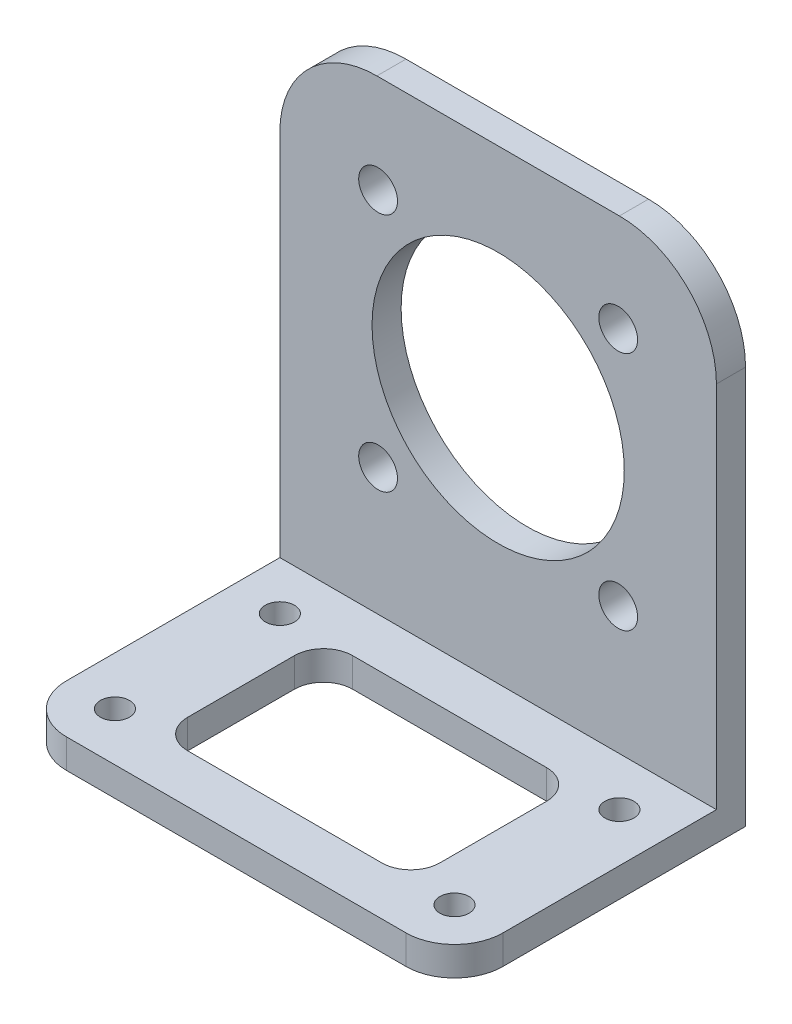
ISO-10303-21;
HEADER;
FILE_DESCRIPTION(('STEP AP214'),'2;1');
FILE_NAME('part.step','',(''),(''),'','','');
FILE_SCHEMA(('AUTOMOTIVE_DESIGN { 1 0 10303 214 1 1 1 1 }'));
ENDSEC;
DATA;
#1=APPLICATION_CONTEXT('core data for automotive mechanical design processes');
#2=APPLICATION_PROTOCOL_DEFINITION('international standard','automotive_design',2000,#1);
#3=PRODUCT_CONTEXT('',#1,'mechanical');
#4=PRODUCT('Part','Part','',(#3));
#5=PRODUCT_RELATED_PRODUCT_CATEGORY('part','',(#4));
#6=PRODUCT_DEFINITION_FORMATION('','',#4);
#7=PRODUCT_DEFINITION_CONTEXT('part definition',#1,'design');
#8=PRODUCT_DEFINITION('design','',#6,#7);
#9=PRODUCT_DEFINITION_SHAPE('','',#8);
#10=(LENGTH_UNIT() NAMED_UNIT(*) SI_UNIT(.MILLI.,.METRE.));
#11=(NAMED_UNIT(*) PLANE_ANGLE_UNIT() SI_UNIT($,.RADIAN.));
#12=(NAMED_UNIT(*) SI_UNIT($,.STERADIAN.) SOLID_ANGLE_UNIT());
#13=UNCERTAINTY_MEASURE_WITH_UNIT(LENGTH_MEASURE(1.E-05),#10,'distance_accuracy_value','');
#14=(GEOMETRIC_REPRESENTATION_CONTEXT(3) GLOBAL_UNCERTAINTY_ASSIGNED_CONTEXT((#13)) GLOBAL_UNIT_ASSIGNED_CONTEXT((#10,
#11,#12)) REPRESENTATION_CONTEXT('',''));
#15=CARTESIAN_POINT('',(0.,0.,0.));
#16=DIRECTION('',(0.,0.,1.));
#17=DIRECTION('',(1.,0.,0.));
#18=AXIS2_PLACEMENT_3D('',#15,#16,#17);
#19=CARTESIAN_POINT('',(22.5,25.5,30.));
#20=DIRECTION('',(-1.,0.,0.));
#21=DIRECTION('',(0.,0.,1.));
#22=AXIS2_PLACEMENT_3D('',#19,#20,#21);
#23=PLANE('',#22);
#24=DIRECTION('',(0.,0.,-1.));
#25=VECTOR('',#24,1.);
#26=CARTESIAN_POINT('',(22.5,-22.5,30.));
#27=LINE('',#26,#25);
#28=CARTESIAN_POINT('',(22.5,-22.5,25.));
#29=VERTEX_POINT('',#28);
#30=CARTESIAN_POINT('',(22.5,-22.5,3.));
#31=VERTEX_POINT('',#30);
#32=EDGE_CURVE('E171',#29,#31,#27,.T.);
#33=ORIENTED_EDGE('',*,*,#32,.F.);
#34=DIRECTION('',(0.,1.,0.));
#35=VECTOR('',#34,1.);
#36=CARTESIAN_POINT('',(22.5,-25.5,25.));
#37=LINE('',#36,#35);
#38=CARTESIAN_POINT('',(22.5,-25.5,25.));
#39=VERTEX_POINT('',#38);
#40=EDGE_CURVE('E11',#29,#39,#37,.F.);
#41=ORIENTED_EDGE('',*,*,#40,.T.);
#42=DIRECTION('',(0.,0.,-1.));
#43=VECTOR('',#42,1.);
#44=CARTESIAN_POINT('',(22.5,-25.5,30.));
#45=LINE('',#44,#43);
#46=CARTESIAN_POINT('',(22.5,-25.5,0.));
#47=VERTEX_POINT('',#46);
#48=EDGE_CURVE('E195',#39,#47,#45,.T.);
#49=ORIENTED_EDGE('',*,*,#48,.T.);
#50=DIRECTION('',(0.,1.,0.));
#51=VECTOR('',#50,1.);
#52=CARTESIAN_POINT('',(22.5,25.5,0.));
#53=LINE('',#52,#51);
#54=CARTESIAN_POINT('',(22.5,15.5,0.));
#55=VERTEX_POINT('',#54);
#56=EDGE_CURVE('E190',#47,#55,#53,.T.);
#57=ORIENTED_EDGE('',*,*,#56,.T.);
#58=DIRECTION('',(0.,0.,-1.));
#59=VECTOR('',#58,1.);
#60=CARTESIAN_POINT('',(22.5,15.5,30.));
#61=LINE('',#60,#59);
#62=CARTESIAN_POINT('',(22.5,15.5,3.));
#63=VERTEX_POINT('',#62);
#64=EDGE_CURVE('E255',#55,#63,#61,.F.);
#65=ORIENTED_EDGE('',*,*,#64,.T.);
#66=DIRECTION('',(0.,1.,0.));
#67=VECTOR('',#66,1.);
#68=CARTESIAN_POINT('',(22.5,25.5,3.));
#69=LINE('',#68,#67);
#70=EDGE_CURVE('E166',#31,#63,#69,.T.);
#71=ORIENTED_EDGE('',*,*,#70,.F.);
#72=EDGE_LOOP('',(#33,#41,#49,#57,#65,#71));
#73=FACE_BOUND('',#72,.T.);
#74=ADVANCED_FACE('F35',(#73),#23,.F.);
#75=CARTESIAN_POINT('',(-22.5,25.5,30.));
#76=DIRECTION('',(0.,-1.,0.));
#77=DIRECTION('',(0.,0.,-1.));
#78=AXIS2_PLACEMENT_3D('',#75,#76,#77);
#79=PLANE('',#78);
#80=DIRECTION('',(1.,0.,0.));
#81=VECTOR('',#80,1.);
#82=CARTESIAN_POINT('',(-22.5,25.5,3.));
#83=LINE('',#82,#81);
#84=CARTESIAN_POINT('',(-12.5,25.5,3.));
#85=VERTEX_POINT('',#84);
#86=CARTESIAN_POINT('',(12.5,25.5,3.));
#87=VERTEX_POINT('',#86);
#88=EDGE_CURVE('E175',#85,#87,#83,.T.);
#89=ORIENTED_EDGE('',*,*,#88,.T.);
#90=DIRECTION('',(0.,0.,-1.));
#91=VECTOR('',#90,1.);
#92=CARTESIAN_POINT('',(12.5,25.5,30.));
#93=LINE('',#92,#91);
#94=CARTESIAN_POINT('',(12.5,25.5,0.));
#95=VERTEX_POINT('',#94);
#96=EDGE_CURVE('E248',#87,#95,#93,.T.);
#97=ORIENTED_EDGE('',*,*,#96,.T.);
#98=DIRECTION('',(-1.,0.,0.));
#99=VECTOR('',#98,1.);
#100=CARTESIAN_POINT('',(-22.5,25.5,0.));
#101=LINE('',#100,#99);
#102=CARTESIAN_POINT('',(-12.5,25.5,0.));
#103=VERTEX_POINT('',#102);
#104=EDGE_CURVE('E199',#95,#103,#101,.T.);
#105=ORIENTED_EDGE('',*,*,#104,.T.);
#106=DIRECTION('',(0.,0.,-1.));
#107=VECTOR('',#106,1.);
#108=CARTESIAN_POINT('',(-12.5,25.5,30.));
#109=LINE('',#108,#107);
#110=EDGE_CURVE('E246',#103,#85,#109,.F.);
#111=ORIENTED_EDGE('',*,*,#110,.T.);
#112=EDGE_LOOP('',(#89,#97,#105,#111));
#113=FACE_BOUND('',#112,.T.);
#114=ADVANCED_FACE('F300',(#113),#79,.F.);
#115=CARTESIAN_POINT('',(-22.5,25.5,30.));
#116=DIRECTION('',(1.,0.,0.));
#117=DIRECTION('',(0.,1.,0.));
#118=AXIS2_PLACEMENT_3D('',#115,#116,#117);
#119=PLANE('',#118);
#120=DIRECTION('',(0.,0.,-1.));
#121=VECTOR('',#120,1.);
#122=CARTESIAN_POINT('',(-22.5,-25.5,30.));
#123=LINE('',#122,#121);
#124=CARTESIAN_POINT('',(-22.5,-25.5,25.));
#125=VERTEX_POINT('',#124);
#126=CARTESIAN_POINT('',(-22.5,-25.5,0.));
#127=VERTEX_POINT('',#126);
#128=EDGE_CURVE('E208',#125,#127,#123,.T.);
#129=ORIENTED_EDGE('',*,*,#128,.F.);
#130=DIRECTION('',(0.,-1.,0.));
#131=VECTOR('',#130,1.);
#132=CARTESIAN_POINT('',(-22.5,-22.5,25.));
#133=LINE('',#132,#131);
#134=CARTESIAN_POINT('',(-22.5,-22.5,25.));
#135=VERTEX_POINT('',#134);
#136=EDGE_CURVE('E58',#125,#135,#133,.F.);
#137=ORIENTED_EDGE('',*,*,#136,.T.);
#138=DIRECTION('',(0.,0.,-1.));
#139=VECTOR('',#138,1.);
#140=CARTESIAN_POINT('',(-22.5,-22.5,30.));
#141=LINE('',#140,#139);
#142=CARTESIAN_POINT('',(-22.5,-22.5,3.));
#143=VERTEX_POINT('',#142);
#144=EDGE_CURVE('E158',#135,#143,#141,.T.);
#145=ORIENTED_EDGE('',*,*,#144,.T.);
#146=DIRECTION('',(0.,1.,0.));
#147=VECTOR('',#146,1.);
#148=CARTESIAN_POINT('',(-22.5,25.5,3.));
#149=LINE('',#148,#147);
#150=CARTESIAN_POINT('',(-22.5,15.5,3.));
#151=VERTEX_POINT('',#150);
#152=EDGE_CURVE('E163',#143,#151,#149,.T.);
#153=ORIENTED_EDGE('',*,*,#152,.T.);
#154=DIRECTION('',(0.,0.,-1.));
#155=VECTOR('',#154,1.);
#156=CARTESIAN_POINT('',(-22.5,15.5,30.));
#157=LINE('',#156,#155);
#158=CARTESIAN_POINT('',(-22.5,15.5,0.));
#159=VERTEX_POINT('',#158);
#160=EDGE_CURVE('E260',#151,#159,#157,.T.);
#161=ORIENTED_EDGE('',*,*,#160,.T.);
#162=DIRECTION('',(0.,-1.,0.));
#163=VECTOR('',#162,1.);
#164=CARTESIAN_POINT('',(-22.5,25.5,0.));
#165=LINE('',#164,#163);
#166=EDGE_CURVE('E202',#159,#127,#165,.T.);
#167=ORIENTED_EDGE('',*,*,#166,.T.);
#168=EDGE_LOOP('',(#129,#137,#145,#153,#161,#167));
#169=FACE_BOUND('',#168,.T.);
#170=ADVANCED_FACE('F160',(#169),#119,.F.);
#171=CARTESIAN_POINT('',(-22.5,-25.5,30.));
#172=DIRECTION('',(0.,1.,0.));
#173=DIRECTION('',(-1.,0.,0.));
#174=AXIS2_PLACEMENT_3D('',#171,#172,#173);
#175=PLANE('',#174);
#176=CARTESIAN_POINT('',(-17.5,-25.5,25.));
#177=DIRECTION('',(0.,1.,0.));
#178=DIRECTION('',(0.,0.,1.));
#179=AXIS2_PLACEMENT_3D('',#176,#177,#178);
#180=CIRCLE('',#179,1.5);
#181=CARTESIAN_POINT('',(-17.5,-25.5,26.5));
#182=VERTEX_POINT('',#181);
#183=EDGE_CURVE('E381',#182,#182,#180,.T.);
#184=ORIENTED_EDGE('',*,*,#183,.T.);
#185=EDGE_LOOP('',(#184));
#186=FACE_BOUND('',#185,.T.);
#187=CARTESIAN_POINT('',(17.5,-25.5,25.));
#188=DIRECTION('',(0.,1.,0.));
#189=DIRECTION('',(0.,0.,-1.));
#190=AXIS2_PLACEMENT_3D('',#187,#188,#189);
#191=CIRCLE('',#190,1.50000000000001);
#192=CARTESIAN_POINT('',(17.5,-25.5,23.5));
#193=VERTEX_POINT('',#192);
#194=EDGE_CURVE('E388',#193,#193,#191,.T.);
#195=ORIENTED_EDGE('',*,*,#194,.T.);
#196=EDGE_LOOP('',(#195));
#197=FACE_BOUND('',#196,.T.);
#198=CARTESIAN_POINT('',(17.5,-25.5,7.99999999999999));
#199=DIRECTION('',(0.,1.,0.));
#200=DIRECTION('',(0.,0.,-1.));
#201=AXIS2_PLACEMENT_3D('',#198,#199,#200);
#202=CIRCLE('',#201,1.5);
#203=CARTESIAN_POINT('',(17.5,-25.5,6.49999999999999));
#204=VERTEX_POINT('',#203);
#205=EDGE_CURVE('E394',#204,#204,#202,.T.);
#206=ORIENTED_EDGE('',*,*,#205,.T.);
#207=EDGE_LOOP('',(#206));
#208=FACE_BOUND('',#207,.T.);
#209=DIRECTION('',(0.,0.,1.));
#210=VECTOR('',#209,1.);
#211=CARTESIAN_POINT('',(-13.,-25.5,8.));
#212=LINE('',#211,#210);
#213=CARTESIAN_POINT('',(-13.,-25.5,11.));
#214=VERTEX_POINT('',#213);
#215=CARTESIAN_POINT('',(-13.,-25.5,22.));
#216=VERTEX_POINT('',#215);
#217=EDGE_CURVE('E351',#214,#216,#212,.T.);
#218=ORIENTED_EDGE('',*,*,#217,.T.);
#219=CARTESIAN_POINT('',(-10.,-25.5,22.));
#220=DIRECTION('',(0.,1.,0.));
#221=DIRECTION('',(-1.,0.,0.));
#222=AXIS2_PLACEMENT_3D('',#219,#220,#221);
#223=CIRCLE('',#222,3.);
#224=CARTESIAN_POINT('',(-10.,-25.5,25.));
#225=VERTEX_POINT('',#224);
#226=EDGE_CURVE('E240',#216,#225,#223,.T.);
#227=ORIENTED_EDGE('',*,*,#226,.T.);
#228=DIRECTION('',(1.,0.,0.));
#229=VECTOR('',#228,1.);
#230=CARTESIAN_POINT('',(-13.,-25.5,25.));
#231=LINE('',#230,#229);
#232=CARTESIAN_POINT('',(9.99999999999999,-25.5,25.));
#233=VERTEX_POINT('',#232);
#234=EDGE_CURVE('E360',#225,#233,#231,.T.);
#235=ORIENTED_EDGE('',*,*,#234,.T.);
#236=CARTESIAN_POINT('',(9.99999999999999,-25.5,22.));
#237=DIRECTION('',(0.,1.,0.));
#238=DIRECTION('',(-1.,0.,0.));
#239=AXIS2_PLACEMENT_3D('',#236,#237,#238);
#240=CIRCLE('',#239,3.);
#241=CARTESIAN_POINT('',(13.,-25.5,22.));
#242=VERTEX_POINT('',#241);
#243=EDGE_CURVE('E236',#233,#242,#240,.T.);
#244=ORIENTED_EDGE('',*,*,#243,.T.);
#245=DIRECTION('',(0.,0.,-1.));
#246=VECTOR('',#245,1.);
#247=CARTESIAN_POINT('',(13.,-25.5,8.));
#248=LINE('',#247,#246);
#249=CARTESIAN_POINT('',(13.,-25.5,11.));
#250=VERTEX_POINT('',#249);
#251=EDGE_CURVE('E365',#242,#250,#248,.T.);
#252=ORIENTED_EDGE('',*,*,#251,.T.);
#253=CARTESIAN_POINT('',(9.99999999999999,-25.5,11.));
#254=DIRECTION('',(0.,1.,0.));
#255=DIRECTION('',(-1.,0.,0.));
#256=AXIS2_PLACEMENT_3D('',#253,#254,#255);
#257=CIRCLE('',#256,3.);
#258=CARTESIAN_POINT('',(9.99999999999999,-25.5,8.));
#259=VERTEX_POINT('',#258);
#260=EDGE_CURVE('E232',#250,#259,#257,.T.);
#261=ORIENTED_EDGE('',*,*,#260,.T.);
#262=DIRECTION('',(-1.,0.,0.));
#263=VECTOR('',#262,1.);
#264=CARTESIAN_POINT('',(-13.,-25.5,8.));
#265=LINE('',#264,#263);
#266=CARTESIAN_POINT('',(-10.,-25.5,8.));
#267=VERTEX_POINT('',#266);
#268=EDGE_CURVE('E354',#259,#267,#265,.T.);
#269=ORIENTED_EDGE('',*,*,#268,.T.);
#270=CARTESIAN_POINT('',(-10.,-25.5,11.));
#271=DIRECTION('',(0.,1.,0.));
#272=DIRECTION('',(-1.,0.,0.));
#273=AXIS2_PLACEMENT_3D('',#270,#271,#272);
#274=CIRCLE('',#273,3.);
#275=EDGE_CURVE('E244',#267,#214,#274,.T.);
#276=ORIENTED_EDGE('',*,*,#275,.T.);
#277=EDGE_LOOP('',(#218,#227,#235,#244,#252,#261,#269,#276));
#278=FACE_BOUND('',#277,.T.);
#279=CARTESIAN_POINT('',(-17.5,-25.5,8.));
#280=DIRECTION('',(0.,1.,0.));
#281=DIRECTION('',(0.,0.,1.));
#282=AXIS2_PLACEMENT_3D('',#279,#280,#281);
#283=CIRCLE('',#282,1.5);
#284=CARTESIAN_POINT('',(-17.5,-25.5,9.5));
#285=VERTEX_POINT('',#284);
#286=EDGE_CURVE('E187',#285,#285,#283,.T.);
#287=ORIENTED_EDGE('',*,*,#286,.T.);
#288=EDGE_LOOP('',(#287));
#289=FACE_BOUND('',#288,.T.);
#290=DIRECTION('',(1.,0.,0.));
#291=VECTOR('',#290,1.);
#292=CARTESIAN_POINT('',(-22.5,-25.5,30.));
#293=LINE('',#292,#291);
#294=CARTESIAN_POINT('',(-17.5,-25.5,30.));
#295=VERTEX_POINT('',#294);
#296=CARTESIAN_POINT('',(17.5,-25.5,30.));
#297=VERTEX_POINT('',#296);
#298=EDGE_CURVE('E192',#295,#297,#293,.T.);
#299=ORIENTED_EDGE('',*,*,#298,.F.);
#300=CARTESIAN_POINT('',(-17.5,-25.5,25.));
#301=DIRECTION('',(0.,1.,0.));
#302=DIRECTION('',(-1.,0.,0.));
#303=AXIS2_PLACEMENT_3D('',#300,#301,#302);
#304=CIRCLE('',#303,5.);
#305=EDGE_CURVE('E270',#295,#125,#304,.F.);
#306=ORIENTED_EDGE('',*,*,#305,.T.);
#307=ORIENTED_EDGE('',*,*,#128,.T.);
#308=DIRECTION('',(1.,0.,0.));
#309=VECTOR('',#308,1.);
#310=CARTESIAN_POINT('',(-22.5,-25.5,0.));
#311=LINE('',#310,#309);
#312=EDGE_CURVE('E196',#127,#47,#311,.T.);
#313=ORIENTED_EDGE('',*,*,#312,.T.);
#314=ORIENTED_EDGE('',*,*,#48,.F.);
#315=CARTESIAN_POINT('',(17.5,-25.5,25.));
#316=DIRECTION('',(0.,1.,0.));
#317=DIRECTION('',(-1.,0.,0.));
#318=AXIS2_PLACEMENT_3D('',#315,#316,#317);
#319=CIRCLE('',#318,5.);
#320=EDGE_CURVE('E268',#39,#297,#319,.F.);
#321=ORIENTED_EDGE('',*,*,#320,.T.);
#322=EDGE_LOOP('',(#299,#306,#307,#313,#314,#321));
#323=FACE_BOUND('',#322,.T.);
#324=ADVANCED_FACE('F282',(#186,#197,#208,#278,#289,#323),#175,.F.);
#325=CARTESIAN_POINT('',(0.,0.,30.));
#326=DIRECTION('',(0.,0.,1.));
#327=DIRECTION('',(1.,0.,0.));
#328=AXIS2_PLACEMENT_3D('',#325,#326,#327);
#329=PLANE('',#328);
#330=DIRECTION('',(1.,0.,0.));
#331=VECTOR('',#330,1.);
#332=CARTESIAN_POINT('',(-22.5,-22.5,30.));
#333=LINE('',#332,#331);
#334=CARTESIAN_POINT('',(-17.5,-22.5,30.));
#335=VERTEX_POINT('',#334);
#336=CARTESIAN_POINT('',(17.5,-22.5,30.));
#337=VERTEX_POINT('',#336);
#338=EDGE_CURVE('E176',#335,#337,#333,.T.);
#339=ORIENTED_EDGE('',*,*,#338,.F.);
#340=DIRECTION('',(0.,-1.,0.));
#341=VECTOR('',#340,1.);
#342=CARTESIAN_POINT('',(-17.5,-25.5,30.));
#343=LINE('',#342,#341);
#344=EDGE_CURVE('E265',#335,#295,#343,.T.);
#345=ORIENTED_EDGE('',*,*,#344,.T.);
#346=ORIENTED_EDGE('',*,*,#298,.T.);
#347=DIRECTION('',(0.,1.,0.));
#348=VECTOR('',#347,1.);
#349=CARTESIAN_POINT('',(17.5,-22.5,30.));
#350=LINE('',#349,#348);
#351=EDGE_CURVE('E262',#297,#337,#350,.T.);
#352=ORIENTED_EDGE('',*,*,#351,.T.);
#353=EDGE_LOOP('',(#339,#345,#346,#352));
#354=FACE_BOUND('',#353,.T.);
#355=ADVANCED_FACE('F277',(#354),#329,.T.);
#356=CARTESIAN_POINT('',(0.,0.,0.));
#357=DIRECTION('',(0.,0.,1.));
#358=DIRECTION('',(1.,0.,0.));
#359=AXIS2_PLACEMENT_3D('',#356,#357,#358);
#360=PLANE('',#359);
#361=CARTESIAN_POINT('',(12.3743686707653,-9.37436867076451,0.));
#362=DIRECTION('',(0.,0.,1.));
#363=DIRECTION('',(1.,0.,0.));
#364=AXIS2_PLACEMENT_3D('',#361,#362,#363);
#365=CIRCLE('',#364,2.);
#366=CARTESIAN_POINT('',(14.3743686707653,-9.37436867076451,0.));
#367=VERTEX_POINT('',#366);
#368=EDGE_CURVE('E373',#367,#367,#365,.T.);
#369=ORIENTED_EDGE('',*,*,#368,.T.);
#370=EDGE_LOOP('',(#369));
#371=FACE_BOUND('',#370,.T.);
#372=CARTESIAN_POINT('',(-12.3743686707639,-9.3743686707653,0.));
#373=DIRECTION('',(0.,0.,1.));
#374=DIRECTION('',(1.,0.,0.));
#375=AXIS2_PLACEMENT_3D('',#372,#373,#374);
#376=CIRCLE('',#375,2.);
#377=CARTESIAN_POINT('',(-10.3743686707639,-9.3743686707653,0.));
#378=VERTEX_POINT('',#377);
#379=EDGE_CURVE('E654',#378,#378,#376,.T.);
#380=ORIENTED_EDGE('',*,*,#379,.T.);
#381=EDGE_LOOP('',(#380));
#382=FACE_BOUND('',#381,.T.);
#383=CARTESIAN_POINT('',(-12.3743686707646,15.3743686707639,0.));
#384=DIRECTION('',(0.,0.,1.));
#385=DIRECTION('',(1.,0.,0.));
#386=AXIS2_PLACEMENT_3D('',#383,#384,#385);
#387=CIRCLE('',#386,2.);
#388=CARTESIAN_POINT('',(-10.3743686707646,15.3743686707639,0.));
#389=VERTEX_POINT('',#388);
#390=EDGE_CURVE('E657',#389,#389,#387,.T.);
#391=ORIENTED_EDGE('',*,*,#390,.T.);
#392=EDGE_LOOP('',(#391));
#393=FACE_BOUND('',#392,.T.);
#394=CARTESIAN_POINT('',(12.3743686707646,15.3743686707645,0.));
#395=DIRECTION('',(0.,0.,1.));
#396=DIRECTION('',(1.,0.,0.));
#397=AXIS2_PLACEMENT_3D('',#394,#395,#396);
#398=CIRCLE('',#397,2.);
#399=CARTESIAN_POINT('',(14.3743686707646,15.3743686707645,0.));
#400=VERTEX_POINT('',#399);
#401=EDGE_CURVE('E660',#400,#400,#398,.T.);
#402=ORIENTED_EDGE('',*,*,#401,.T.);
#403=EDGE_LOOP('',(#402));
#404=FACE_BOUND('',#403,.T.);
#405=CARTESIAN_POINT('',(0.,3.,0.));
#406=DIRECTION('',(0.,0.,1.));
#407=DIRECTION('',(1.,0.,0.));
#408=AXIS2_PLACEMENT_3D('',#405,#406,#407);
#409=CIRCLE('',#408,13.);
#410=CARTESIAN_POINT('',(13.,3.,0.));
#411=VERTEX_POINT('',#410);
#412=EDGE_CURVE('E663',#411,#411,#409,.T.);
#413=ORIENTED_EDGE('',*,*,#412,.T.);
#414=EDGE_LOOP('',(#413));
#415=FACE_BOUND('',#414,.T.);
#416=ORIENTED_EDGE('',*,*,#104,.F.);
#417=CARTESIAN_POINT('',(12.5,15.5,0.));
#418=DIRECTION('',(0.,0.,1.));
#419=DIRECTION('',(1.,0.,0.));
#420=AXIS2_PLACEMENT_3D('',#417,#418,#419);
#421=CIRCLE('',#420,10.);
#422=EDGE_CURVE('E253',#95,#55,#421,.F.);
#423=ORIENTED_EDGE('',*,*,#422,.T.);
#424=ORIENTED_EDGE('',*,*,#56,.F.);
#425=ORIENTED_EDGE('',*,*,#312,.F.);
#426=ORIENTED_EDGE('',*,*,#166,.F.);
#427=CARTESIAN_POINT('',(-12.5,15.5,0.));
#428=DIRECTION('',(0.,0.,1.));
#429=DIRECTION('',(1.,0.,0.));
#430=AXIS2_PLACEMENT_3D('',#427,#428,#429);
#431=CIRCLE('',#430,10.);
#432=EDGE_CURVE('E251',#159,#103,#431,.F.);
#433=ORIENTED_EDGE('',*,*,#432,.T.);
#434=EDGE_LOOP('',(#416,#423,#424,#425,#426,#433));
#435=FACE_BOUND('',#434,.T.);
#436=ADVANCED_FACE('F288',(#371,#382,#393,#404,#415,#435),#360,.F.);
#437=CARTESIAN_POINT('',(-22.5,25.5,3.));
#438=DIRECTION('',(0.,0.,-1.));
#439=DIRECTION('',(-1.,0.,0.));
#440=AXIS2_PLACEMENT_3D('',#437,#438,#439);
#441=PLANE('',#440);
#442=CARTESIAN_POINT('',(12.3743686707653,-9.37436867076451,3.));
#443=DIRECTION('',(0.,0.,1.));
#444=DIRECTION('',(1.,0.,0.));
#445=AXIS2_PLACEMENT_3D('',#442,#443,#444);
#446=CIRCLE('',#445,2.);
#447=CARTESIAN_POINT('',(14.3743686707653,-9.37436867076451,3.));
#448=VERTEX_POINT('',#447);
#449=EDGE_CURVE('E670',#448,#448,#446,.T.);
#450=ORIENTED_EDGE('',*,*,#449,.F.);
#451=EDGE_LOOP('',(#450));
#452=FACE_BOUND('',#451,.T.);
#453=CARTESIAN_POINT('',(-12.3743686707639,-9.3743686707653,3.));
#454=DIRECTION('',(0.,0.,1.));
#455=DIRECTION('',(1.,0.,0.));
#456=AXIS2_PLACEMENT_3D('',#453,#454,#455);
#457=CIRCLE('',#456,2.);
#458=CARTESIAN_POINT('',(-10.3743686707639,-9.3743686707653,3.));
#459=VERTEX_POINT('',#458);
#460=EDGE_CURVE('E673',#459,#459,#457,.T.);
#461=ORIENTED_EDGE('',*,*,#460,.F.);
#462=EDGE_LOOP('',(#461));
#463=FACE_BOUND('',#462,.T.);
#464=CARTESIAN_POINT('',(-12.3743686707646,15.3743686707639,3.));
#465=DIRECTION('',(0.,0.,1.));
#466=DIRECTION('',(1.,0.,0.));
#467=AXIS2_PLACEMENT_3D('',#464,#465,#466);
#468=CIRCLE('',#467,2.);
#469=CARTESIAN_POINT('',(-10.3743686707646,15.3743686707639,3.));
#470=VERTEX_POINT('',#469);
#471=EDGE_CURVE('E676',#470,#470,#468,.T.);
#472=ORIENTED_EDGE('',*,*,#471,.F.);
#473=EDGE_LOOP('',(#472));
#474=FACE_BOUND('',#473,.T.);
#475=CARTESIAN_POINT('',(12.3743686707646,15.3743686707645,3.));
#476=DIRECTION('',(0.,0.,1.));
#477=DIRECTION('',(1.,0.,0.));
#478=AXIS2_PLACEMENT_3D('',#475,#476,#477);
#479=CIRCLE('',#478,2.);
#480=CARTESIAN_POINT('',(14.3743686707646,15.3743686707645,3.));
#481=VERTEX_POINT('',#480);
#482=EDGE_CURVE('E669',#481,#481,#479,.T.);
#483=ORIENTED_EDGE('',*,*,#482,.F.);
#484=EDGE_LOOP('',(#483));
#485=FACE_BOUND('',#484,.T.);
#486=CARTESIAN_POINT('',(0.,3.,3.));
#487=DIRECTION('',(0.,0.,1.));
#488=DIRECTION('',(1.,0.,0.));
#489=AXIS2_PLACEMENT_3D('',#486,#487,#488);
#490=CIRCLE('',#489,13.);
#491=CARTESIAN_POINT('',(13.,3.,3.));
#492=VERTEX_POINT('',#491);
#493=EDGE_CURVE('E666',#492,#492,#490,.T.);
#494=ORIENTED_EDGE('',*,*,#493,.F.);
#495=EDGE_LOOP('',(#494));
#496=FACE_BOUND('',#495,.T.);
#497=ORIENTED_EDGE('',*,*,#70,.T.);
#498=CARTESIAN_POINT('',(12.5,15.5,3.));
#499=DIRECTION('',(0.,0.,-1.));
#500=DIRECTION('',(-1.,0.,0.));
#501=AXIS2_PLACEMENT_3D('',#498,#499,#500);
#502=CIRCLE('',#501,10.);
#503=EDGE_CURVE('E258',#63,#87,#502,.F.);
#504=ORIENTED_EDGE('',*,*,#503,.T.);
#505=ORIENTED_EDGE('',*,*,#88,.F.);
#506=CARTESIAN_POINT('',(-12.5,15.5,3.));
#507=DIRECTION('',(0.,0.,-1.));
#508=DIRECTION('',(-1.,0.,0.));
#509=AXIS2_PLACEMENT_3D('',#506,#507,#508);
#510=CIRCLE('',#509,10.);
#511=EDGE_CURVE('E181',#85,#151,#510,.F.);
#512=ORIENTED_EDGE('',*,*,#511,.T.);
#513=ORIENTED_EDGE('',*,*,#152,.F.);
#514=DIRECTION('',(1.,0.,0.));
#515=VECTOR('',#514,1.);
#516=CARTESIAN_POINT('',(-22.5,-22.5,3.));
#517=LINE('',#516,#515);
#518=EDGE_CURVE('E169',#143,#31,#517,.T.);
#519=ORIENTED_EDGE('',*,*,#518,.T.);
#520=EDGE_LOOP('',(#497,#504,#505,#512,#513,#519));
#521=FACE_BOUND('',#520,.T.);
#522=ADVANCED_FACE('F178',(#452,#463,#474,#485,#496,#521),#441,.F.);
#523=CARTESIAN_POINT('',(-22.5,-22.5,30.));
#524=DIRECTION('',(0.,-1.,0.));
#525=DIRECTION('',(0.,0.,-1.));
#526=AXIS2_PLACEMENT_3D('',#523,#524,#525);
#527=PLANE('',#526);
#528=CARTESIAN_POINT('',(-17.5,-22.5,25.));
#529=DIRECTION('',(0.,1.,0.));
#530=DIRECTION('',(0.,0.,1.));
#531=AXIS2_PLACEMENT_3D('',#528,#529,#530);
#532=CIRCLE('',#531,1.5);
#533=CARTESIAN_POINT('',(-17.5,-22.5,26.5));
#534=VERTEX_POINT('',#533);
#535=EDGE_CURVE('E385',#534,#534,#532,.T.);
#536=ORIENTED_EDGE('',*,*,#535,.F.);
#537=EDGE_LOOP('',(#536));
#538=FACE_BOUND('',#537,.T.);
#539=CARTESIAN_POINT('',(17.5,-22.5,25.));
#540=DIRECTION('',(0.,1.,0.));
#541=DIRECTION('',(0.,0.,-1.));
#542=AXIS2_PLACEMENT_3D('',#539,#540,#541);
#543=CIRCLE('',#542,1.50000000000001);
#544=CARTESIAN_POINT('',(17.5,-22.5,23.5));
#545=VERTEX_POINT('',#544);
#546=EDGE_CURVE('E391',#545,#545,#543,.T.);
#547=ORIENTED_EDGE('',*,*,#546,.F.);
#548=EDGE_LOOP('',(#547));
#549=FACE_BOUND('',#548,.T.);
#550=CARTESIAN_POINT('',(17.5,-22.5,7.99999999999999));
#551=DIRECTION('',(0.,1.,0.));
#552=DIRECTION('',(0.,0.,-1.));
#553=AXIS2_PLACEMENT_3D('',#550,#551,#552);
#554=CIRCLE('',#553,1.5);
#555=CARTESIAN_POINT('',(17.5,-22.5,6.49999999999999));
#556=VERTEX_POINT('',#555);
#557=EDGE_CURVE('E363',#556,#556,#554,.T.);
#558=ORIENTED_EDGE('',*,*,#557,.F.);
#559=EDGE_LOOP('',(#558));
#560=FACE_BOUND('',#559,.T.);
#561=DIRECTION('',(-1.,0.,0.));
#562=VECTOR('',#561,1.);
#563=CARTESIAN_POINT('',(-13.,-22.5,8.));
#564=LINE('',#563,#562);
#565=CARTESIAN_POINT('',(9.99999999999999,-22.5,8.));
#566=VERTEX_POINT('',#565);
#567=CARTESIAN_POINT('',(-10.,-22.5,8.));
#568=VERTEX_POINT('',#567);
#569=EDGE_CURVE('E372',#566,#568,#564,.T.);
#570=ORIENTED_EDGE('',*,*,#569,.F.);
#571=CARTESIAN_POINT('',(9.99999999999999,-22.5,11.));
#572=DIRECTION('',(0.,-1.,0.));
#573=DIRECTION('',(0.,0.,-1.));
#574=AXIS2_PLACEMENT_3D('',#571,#572,#573);
#575=CIRCLE('',#574,3.);
#576=CARTESIAN_POINT('',(13.,-22.5,11.));
#577=VERTEX_POINT('',#576);
#578=EDGE_CURVE('E230',#566,#577,#575,.T.);
#579=ORIENTED_EDGE('',*,*,#578,.T.);
#580=DIRECTION('',(0.,0.,-1.));
#581=VECTOR('',#580,1.);
#582=CARTESIAN_POINT('',(13.,-22.5,8.));
#583=LINE('',#582,#581);
#584=CARTESIAN_POINT('',(13.,-22.5,22.));
#585=VERTEX_POINT('',#584);
#586=EDGE_CURVE('E369',#585,#577,#583,.T.);
#587=ORIENTED_EDGE('',*,*,#586,.F.);
#588=CARTESIAN_POINT('',(9.99999999999999,-22.5,22.));
#589=DIRECTION('',(0.,-1.,0.));
#590=DIRECTION('',(0.,0.,-1.));
#591=AXIS2_PLACEMENT_3D('',#588,#589,#590);
#592=CIRCLE('',#591,3.);
#593=CARTESIAN_POINT('',(9.99999999999999,-22.5,25.));
#594=VERTEX_POINT('',#593);
#595=EDGE_CURVE('E234',#585,#594,#592,.T.);
#596=ORIENTED_EDGE('',*,*,#595,.T.);
#597=DIRECTION('',(1.,0.,0.));
#598=VECTOR('',#597,1.);
#599=CARTESIAN_POINT('',(-13.,-22.5,25.));
#600=LINE('',#599,#598);
#601=CARTESIAN_POINT('',(-10.,-22.5,25.));
#602=VERTEX_POINT('',#601);
#603=EDGE_CURVE('E378',#602,#594,#600,.T.);
#604=ORIENTED_EDGE('',*,*,#603,.F.);
#605=CARTESIAN_POINT('',(-10.,-22.5,22.));
#606=DIRECTION('',(0.,-1.,0.));
#607=DIRECTION('',(0.,0.,-1.));
#608=AXIS2_PLACEMENT_3D('',#605,#606,#607);
#609=CIRCLE('',#608,3.);
#610=CARTESIAN_POINT('',(-13.,-22.5,22.));
#611=VERTEX_POINT('',#610);
#612=EDGE_CURVE('E238',#602,#611,#609,.T.);
#613=ORIENTED_EDGE('',*,*,#612,.T.);
#614=DIRECTION('',(0.,0.,1.));
#615=VECTOR('',#614,1.);
#616=CARTESIAN_POINT('',(-13.,-22.5,8.));
#617=LINE('',#616,#615);
#618=CARTESIAN_POINT('',(-13.,-22.5,11.));
#619=VERTEX_POINT('',#618);
#620=EDGE_CURVE('E376',#619,#611,#617,.T.);
#621=ORIENTED_EDGE('',*,*,#620,.F.);
#622=CARTESIAN_POINT('',(-10.,-22.5,11.));
#623=DIRECTION('',(0.,-1.,0.));
#624=DIRECTION('',(0.,0.,-1.));
#625=AXIS2_PLACEMENT_3D('',#622,#623,#624);
#626=CIRCLE('',#625,3.);
#627=EDGE_CURVE('E242',#619,#568,#626,.T.);
#628=ORIENTED_EDGE('',*,*,#627,.T.);
#629=EDGE_LOOP('',(#570,#579,#587,#596,#604,#613,#621,#628));
#630=FACE_BOUND('',#629,.T.);
#631=CARTESIAN_POINT('',(-17.5,-22.5,8.));
#632=DIRECTION('',(0.,1.,0.));
#633=DIRECTION('',(0.,0.,1.));
#634=AXIS2_PLACEMENT_3D('',#631,#632,#633);
#635=CIRCLE('',#634,1.5);
#636=CARTESIAN_POINT('',(-17.5,-22.5,9.5));
#637=VERTEX_POINT('',#636);
#638=EDGE_CURVE('E384',#637,#637,#635,.T.);
#639=ORIENTED_EDGE('',*,*,#638,.F.);
#640=EDGE_LOOP('',(#639));
#641=FACE_BOUND('',#640,.T.);
#642=ORIENTED_EDGE('',*,*,#144,.F.);
#643=CARTESIAN_POINT('',(-17.5,-22.5,25.));
#644=DIRECTION('',(0.,-1.,0.));
#645=DIRECTION('',(0.,0.,-1.));
#646=AXIS2_PLACEMENT_3D('',#643,#644,#645);
#647=CIRCLE('',#646,5.);
#648=EDGE_CURVE('E43',#135,#335,#647,.F.);
#649=ORIENTED_EDGE('',*,*,#648,.T.);
#650=ORIENTED_EDGE('',*,*,#338,.T.);
#651=CARTESIAN_POINT('',(17.5,-22.5,25.));
#652=DIRECTION('',(0.,-1.,0.));
#653=DIRECTION('',(0.,0.,-1.));
#654=AXIS2_PLACEMENT_3D('',#651,#652,#653);
#655=CIRCLE('',#654,5.);
#656=EDGE_CURVE('E50',#337,#29,#655,.F.);
#657=ORIENTED_EDGE('',*,*,#656,.T.);
#658=ORIENTED_EDGE('',*,*,#32,.T.);
#659=ORIENTED_EDGE('',*,*,#518,.F.);
#660=EDGE_LOOP('',(#642,#649,#650,#657,#658,#659));
#661=FACE_BOUND('',#660,.T.);
#662=ADVANCED_FACE('F170',(#538,#549,#560,#630,#641,#661),#527,.F.);
#663=CARTESIAN_POINT('',(-17.5,-25.5,8.));
#664=DIRECTION('',(0.,1.,0.));
#665=DIRECTION('',(0.,0.,1.));
#666=AXIS2_PLACEMENT_3D('',#663,#664,#665);
#667=CYLINDRICAL_SURFACE('',#666,1.5);
#668=ORIENTED_EDGE('',*,*,#286,.F.);
#669=EDGE_LOOP('',(#668));
#670=FACE_BOUND('',#669,.T.);
#671=ORIENTED_EDGE('',*,*,#638,.T.);
#672=EDGE_LOOP('',(#671));
#673=FACE_BOUND('',#672,.T.);
#674=ADVANCED_FACE('F399',(#670,#673),#667,.F.);
#675=CARTESIAN_POINT('',(13.,-25.5,8.));
#676=DIRECTION('',(1.,0.,0.));
#677=DIRECTION('',(0.,0.,-1.));
#678=AXIS2_PLACEMENT_3D('',#675,#676,#677);
#679=PLANE('',#678);
#680=ORIENTED_EDGE('',*,*,#586,.T.);
#681=DIRECTION('',(0.,1.,0.));
#682=VECTOR('',#681,1.);
#683=CARTESIAN_POINT('',(13.,-25.5,11.));
#684=LINE('',#683,#682);
#685=EDGE_CURVE('E218',#577,#250,#684,.F.);
#686=ORIENTED_EDGE('',*,*,#685,.T.);
#687=ORIENTED_EDGE('',*,*,#251,.F.);
#688=DIRECTION('',(0.,1.,0.));
#689=VECTOR('',#688,1.);
#690=CARTESIAN_POINT('',(13.,-22.5,22.));
#691=LINE('',#690,#689);
#692=EDGE_CURVE('E215',#242,#585,#691,.T.);
#693=ORIENTED_EDGE('',*,*,#692,.T.);
#694=EDGE_LOOP('',(#680,#686,#687,#693));
#695=FACE_BOUND('',#694,.T.);
#696=ADVANCED_FACE('F408',(#695),#679,.F.);
#697=CARTESIAN_POINT('',(-13.,-25.5,25.));
#698=DIRECTION('',(0.,0.,1.));
#699=DIRECTION('',(1.,0.,0.));
#700=AXIS2_PLACEMENT_3D('',#697,#698,#699);
#701=PLANE('',#700);
#702=ORIENTED_EDGE('',*,*,#603,.T.);
#703=DIRECTION('',(0.,1.,0.));
#704=VECTOR('',#703,1.);
#705=CARTESIAN_POINT('',(9.99999999999999,-25.5,25.));
#706=LINE('',#705,#704);
#707=EDGE_CURVE('E223',#594,#233,#706,.F.);
#708=ORIENTED_EDGE('',*,*,#707,.T.);
#709=ORIENTED_EDGE('',*,*,#234,.F.);
#710=DIRECTION('',(0.,1.,0.));
#711=VECTOR('',#710,1.);
#712=CARTESIAN_POINT('',(-10.,-22.5,25.));
#713=LINE('',#712,#711);
#714=EDGE_CURVE('E220',#225,#602,#713,.T.);
#715=ORIENTED_EDGE('',*,*,#714,.T.);
#716=EDGE_LOOP('',(#702,#708,#709,#715));
#717=FACE_BOUND('',#716,.T.);
#718=ADVANCED_FACE('F562',(#717),#701,.F.);
#719=CARTESIAN_POINT('',(-13.,-25.5,8.));
#720=DIRECTION('',(-1.,0.,0.));
#721=DIRECTION('',(0.,0.,1.));
#722=AXIS2_PLACEMENT_3D('',#719,#720,#721);
#723=PLANE('',#722);
#724=ORIENTED_EDGE('',*,*,#620,.T.);
#725=DIRECTION('',(0.,1.,0.));
#726=VECTOR('',#725,1.);
#727=CARTESIAN_POINT('',(-13.,-25.5,22.));
#728=LINE('',#727,#726);
#729=EDGE_CURVE('E228',#611,#216,#728,.F.);
#730=ORIENTED_EDGE('',*,*,#729,.T.);
#731=ORIENTED_EDGE('',*,*,#217,.F.);
#732=DIRECTION('',(0.,1.,0.));
#733=VECTOR('',#732,1.);
#734=CARTESIAN_POINT('',(-13.,-22.5,11.));
#735=LINE('',#734,#733);
#736=EDGE_CURVE('E225',#214,#619,#735,.T.);
#737=ORIENTED_EDGE('',*,*,#736,.T.);
#738=EDGE_LOOP('',(#724,#730,#731,#737));
#739=FACE_BOUND('',#738,.T.);
#740=ADVANCED_FACE('F357',(#739),#723,.F.);
#741=CARTESIAN_POINT('',(-13.,-25.5,8.));
#742=DIRECTION('',(0.,0.,-1.));
#743=DIRECTION('',(-1.,0.,0.));
#744=AXIS2_PLACEMENT_3D('',#741,#742,#743);
#745=PLANE('',#744);
#746=ORIENTED_EDGE('',*,*,#268,.F.);
#747=DIRECTION('',(0.,1.,0.));
#748=VECTOR('',#747,1.);
#749=CARTESIAN_POINT('',(9.99999999999999,-22.5,8.));
#750=LINE('',#749,#748);
#751=EDGE_CURVE('E212',#259,#566,#750,.T.);
#752=ORIENTED_EDGE('',*,*,#751,.T.);
#753=ORIENTED_EDGE('',*,*,#569,.T.);
#754=DIRECTION('',(0.,1.,0.));
#755=VECTOR('',#754,1.);
#756=CARTESIAN_POINT('',(-10.,-25.5,8.));
#757=LINE('',#756,#755);
#758=EDGE_CURVE('E210',#568,#267,#757,.F.);
#759=ORIENTED_EDGE('',*,*,#758,.T.);
#760=EDGE_LOOP('',(#746,#752,#753,#759));
#761=FACE_BOUND('',#760,.T.);
#762=ADVANCED_FACE('F545',(#761),#745,.F.);
#763=CARTESIAN_POINT('',(17.5,-25.5,7.99999999999999));
#764=DIRECTION('',(0.,1.,0.));
#765=DIRECTION('',(0.,0.,1.));
#766=AXIS2_PLACEMENT_3D('',#763,#764,#765);
#767=CYLINDRICAL_SURFACE('',#766,1.5);
#768=ORIENTED_EDGE('',*,*,#205,.F.);
#769=EDGE_LOOP('',(#768));
#770=FACE_BOUND('',#769,.T.);
#771=ORIENTED_EDGE('',*,*,#557,.T.);
#772=EDGE_LOOP('',(#771));
#773=FACE_BOUND('',#772,.T.);
#774=ADVANCED_FACE('F550',(#770,#773),#767,.F.);
#775=CARTESIAN_POINT('',(17.5,-25.5,25.));
#776=DIRECTION('',(0.,1.,0.));
#777=DIRECTION('',(0.,0.,1.));
#778=AXIS2_PLACEMENT_3D('',#775,#776,#777);
#779=CYLINDRICAL_SURFACE('',#778,1.50000000000001);
#780=ORIENTED_EDGE('',*,*,#194,.F.);
#781=EDGE_LOOP('',(#780));
#782=FACE_BOUND('',#781,.T.);
#783=ORIENTED_EDGE('',*,*,#546,.T.);
#784=EDGE_LOOP('',(#783));
#785=FACE_BOUND('',#784,.T.);
#786=ADVANCED_FACE('F588',(#782,#785),#779,.F.);
#787=CARTESIAN_POINT('',(-17.5,-25.5,25.));
#788=DIRECTION('',(0.,1.,0.));
#789=DIRECTION('',(0.,0.,1.));
#790=AXIS2_PLACEMENT_3D('',#787,#788,#789);
#791=CYLINDRICAL_SURFACE('',#790,1.5);
#792=ORIENTED_EDGE('',*,*,#183,.F.);
#793=EDGE_LOOP('',(#792));
#794=FACE_BOUND('',#793,.T.);
#795=ORIENTED_EDGE('',*,*,#535,.T.);
#796=EDGE_LOOP('',(#795));
#797=FACE_BOUND('',#796,.T.);
#798=ADVANCED_FACE('F324',(#794,#797),#791,.F.);
#799=CARTESIAN_POINT('',(9.99999999999999,-25.5,11.));
#800=DIRECTION('',(0.,-1.,0.));
#801=DIRECTION('',(0.,0.,-1.));
#802=AXIS2_PLACEMENT_3D('',#799,#800,#801);
#803=CYLINDRICAL_SURFACE('',#802,3.);
#804=ORIENTED_EDGE('',*,*,#260,.F.);
#805=ORIENTED_EDGE('',*,*,#685,.F.);
#806=ORIENTED_EDGE('',*,*,#578,.F.);
#807=ORIENTED_EDGE('',*,*,#751,.F.);
#808=EDGE_LOOP('',(#804,#805,#806,#807));
#809=FACE_BOUND('',#808,.T.);
#810=ADVANCED_FACE('F320',(#809),#803,.F.);
#811=CARTESIAN_POINT('',(9.99999999999999,-25.5,22.));
#812=DIRECTION('',(0.,-1.,0.));
#813=DIRECTION('',(0.,0.,-1.));
#814=AXIS2_PLACEMENT_3D('',#811,#812,#813);
#815=CYLINDRICAL_SURFACE('',#814,3.);
#816=ORIENTED_EDGE('',*,*,#243,.F.);
#817=ORIENTED_EDGE('',*,*,#707,.F.);
#818=ORIENTED_EDGE('',*,*,#595,.F.);
#819=ORIENTED_EDGE('',*,*,#692,.F.);
#820=EDGE_LOOP('',(#816,#817,#818,#819));
#821=FACE_BOUND('',#820,.T.);
#822=ADVANCED_FACE('F323',(#821),#815,.F.);
#823=CARTESIAN_POINT('',(-10.,-25.5,22.));
#824=DIRECTION('',(0.,-1.,0.));
#825=DIRECTION('',(0.,0.,-1.));
#826=AXIS2_PLACEMENT_3D('',#823,#824,#825);
#827=CYLINDRICAL_SURFACE('',#826,3.);
#828=ORIENTED_EDGE('',*,*,#226,.F.);
#829=ORIENTED_EDGE('',*,*,#729,.F.);
#830=ORIENTED_EDGE('',*,*,#612,.F.);
#831=ORIENTED_EDGE('',*,*,#714,.F.);
#832=EDGE_LOOP('',(#828,#829,#830,#831));
#833=FACE_BOUND('',#832,.T.);
#834=ADVANCED_FACE('F328',(#833),#827,.F.);
#835=CARTESIAN_POINT('',(-10.,-25.5,11.));
#836=DIRECTION('',(0.,-1.,0.));
#837=DIRECTION('',(0.,0.,-1.));
#838=AXIS2_PLACEMENT_3D('',#835,#836,#837);
#839=CYLINDRICAL_SURFACE('',#838,3.);
#840=ORIENTED_EDGE('',*,*,#275,.F.);
#841=ORIENTED_EDGE('',*,*,#758,.F.);
#842=ORIENTED_EDGE('',*,*,#627,.F.);
#843=ORIENTED_EDGE('',*,*,#736,.F.);
#844=EDGE_LOOP('',(#840,#841,#842,#843));
#845=FACE_BOUND('',#844,.T.);
#846=ADVANCED_FACE('F332',(#845),#839,.F.);
#847=CARTESIAN_POINT('',(0.,3.,-27.));
#848=DIRECTION('',(0.,0.,1.));
#849=DIRECTION('',(1.,0.,0.));
#850=AXIS2_PLACEMENT_3D('',#847,#848,#849);
#851=CYLINDRICAL_SURFACE('',#850,13.);
#852=ORIENTED_EDGE('',*,*,#493,.T.);
#853=EDGE_LOOP('',(#852));
#854=FACE_BOUND('',#853,.T.);
#855=ORIENTED_EDGE('',*,*,#412,.F.);
#856=EDGE_LOOP('',(#855));
#857=FACE_BOUND('',#856,.T.);
#858=ADVANCED_FACE('F335',(#854,#857),#851,.F.);
#859=CARTESIAN_POINT('',(12.3743686707646,15.3743686707645,-27.));
#860=DIRECTION('',(0.,0.,1.));
#861=DIRECTION('',(1.,0.,0.));
#862=AXIS2_PLACEMENT_3D('',#859,#860,#861);
#863=CYLINDRICAL_SURFACE('',#862,2.);
#864=ORIENTED_EDGE('',*,*,#482,.T.);
#865=EDGE_LOOP('',(#864));
#866=FACE_BOUND('',#865,.T.);
#867=ORIENTED_EDGE('',*,*,#401,.F.);
#868=EDGE_LOOP('',(#867));
#869=FACE_BOUND('',#868,.T.);
#870=ADVANCED_FACE('F340',(#866,#869),#863,.F.);
#871=CARTESIAN_POINT('',(-12.3743686707646,15.3743686707639,-27.));
#872=DIRECTION('',(0.,0.,1.));
#873=DIRECTION('',(1.,0.,0.));
#874=AXIS2_PLACEMENT_3D('',#871,#872,#873);
#875=CYLINDRICAL_SURFACE('',#874,2.);
#876=ORIENTED_EDGE('',*,*,#471,.T.);
#877=EDGE_LOOP('',(#876));
#878=FACE_BOUND('',#877,.T.);
#879=ORIENTED_EDGE('',*,*,#390,.F.);
#880=EDGE_LOOP('',(#879));
#881=FACE_BOUND('',#880,.T.);
#882=ADVANCED_FACE('F491',(#878,#881),#875,.F.);
#883=CARTESIAN_POINT('',(-12.3743686707639,-9.3743686707653,-27.));
#884=DIRECTION('',(0.,0.,1.));
#885=DIRECTION('',(1.,0.,0.));
#886=AXIS2_PLACEMENT_3D('',#883,#884,#885);
#887=CYLINDRICAL_SURFACE('',#886,2.);
#888=ORIENTED_EDGE('',*,*,#460,.T.);
#889=EDGE_LOOP('',(#888));
#890=FACE_BOUND('',#889,.T.);
#891=ORIENTED_EDGE('',*,*,#379,.F.);
#892=EDGE_LOOP('',(#891));
#893=FACE_BOUND('',#892,.T.);
#894=ADVANCED_FACE('F481',(#890,#893),#887,.F.);
#895=CARTESIAN_POINT('',(12.3743686707653,-9.37436867076451,-27.));
#896=DIRECTION('',(0.,0.,1.));
#897=DIRECTION('',(1.,0.,0.));
#898=AXIS2_PLACEMENT_3D('',#895,#896,#897);
#899=CYLINDRICAL_SURFACE('',#898,2.);
#900=ORIENTED_EDGE('',*,*,#449,.T.);
#901=EDGE_LOOP('',(#900));
#902=FACE_BOUND('',#901,.T.);
#903=ORIENTED_EDGE('',*,*,#368,.F.);
#904=EDGE_LOOP('',(#903));
#905=FACE_BOUND('',#904,.T.);
#906=ADVANCED_FACE('F310',(#902,#905),#899,.F.);
#907=CARTESIAN_POINT('',(12.5,15.5,30.));
#908=DIRECTION('',(0.,0.,-1.));
#909=DIRECTION('',(-1.,0.,0.));
#910=AXIS2_PLACEMENT_3D('',#907,#908,#909);
#911=CYLINDRICAL_SURFACE('',#910,10.);
#912=ORIENTED_EDGE('',*,*,#503,.F.);
#913=ORIENTED_EDGE('',*,*,#64,.F.);
#914=ORIENTED_EDGE('',*,*,#422,.F.);
#915=ORIENTED_EDGE('',*,*,#96,.F.);
#916=EDGE_LOOP('',(#912,#913,#914,#915));
#917=FACE_BOUND('',#916,.T.);
#918=ADVANCED_FACE('F298',(#917),#911,.T.);
#919=CARTESIAN_POINT('',(-12.5,15.5,30.));
#920=DIRECTION('',(0.,0.,-1.));
#921=DIRECTION('',(-1.,0.,0.));
#922=AXIS2_PLACEMENT_3D('',#919,#920,#921);
#923=CYLINDRICAL_SURFACE('',#922,10.);
#924=ORIENTED_EDGE('',*,*,#511,.F.);
#925=ORIENTED_EDGE('',*,*,#110,.F.);
#926=ORIENTED_EDGE('',*,*,#432,.F.);
#927=ORIENTED_EDGE('',*,*,#160,.F.);
#928=EDGE_LOOP('',(#924,#925,#926,#927));
#929=FACE_BOUND('',#928,.T.);
#930=ADVANCED_FACE('F303',(#929),#923,.T.);
#931=CARTESIAN_POINT('',(-17.5,0.,25.));
#932=DIRECTION('',(0.,1.,0.));
#933=DIRECTION('',(-1.,0.,0.));
#934=AXIS2_PLACEMENT_3D('',#931,#932,#933);
#935=CYLINDRICAL_SURFACE('',#934,5.);
#936=ORIENTED_EDGE('',*,*,#648,.F.);
#937=ORIENTED_EDGE('',*,*,#136,.F.);
#938=ORIENTED_EDGE('',*,*,#305,.F.);
#939=ORIENTED_EDGE('',*,*,#344,.F.);
#940=EDGE_LOOP('',(#936,#937,#938,#939));
#941=FACE_BOUND('',#940,.T.);
#942=ADVANCED_FACE('F280',(#941),#935,.T.);
#943=CARTESIAN_POINT('',(17.5,0.,25.));
#944=DIRECTION('',(0.,-1.,0.));
#945=DIRECTION('',(0.,0.,-1.));
#946=AXIS2_PLACEMENT_3D('',#943,#944,#945);
#947=CYLINDRICAL_SURFACE('',#946,5.);
#948=ORIENTED_EDGE('',*,*,#320,.F.);
#949=ORIENTED_EDGE('',*,*,#40,.F.);
#950=ORIENTED_EDGE('',*,*,#656,.F.);
#951=ORIENTED_EDGE('',*,*,#351,.F.);
#952=EDGE_LOOP('',(#948,#949,#950,#951));
#953=FACE_BOUND('',#952,.T.);
#954=ADVANCED_FACE('F37',(#953),#947,.T.);
#955=CLOSED_SHELL('',(#74,#114,#170,#324,#355,#436,#522,#662,#674,#696,#718,#740,#762,#774,#786,
#798,#810,#822,#834,#846,#858,#870,#882,#894,#906,#918,#930,#942,#954));
#956=MANIFOLD_SOLID_BREP('B2',#955);
#957=ADVANCED_BREP_SHAPE_REPRESENTATION('',(#18,#956),#14);
#958=SHAPE_DEFINITION_REPRESENTATION(#9,#957);
ENDSEC;
END-ISO-10303-21;
